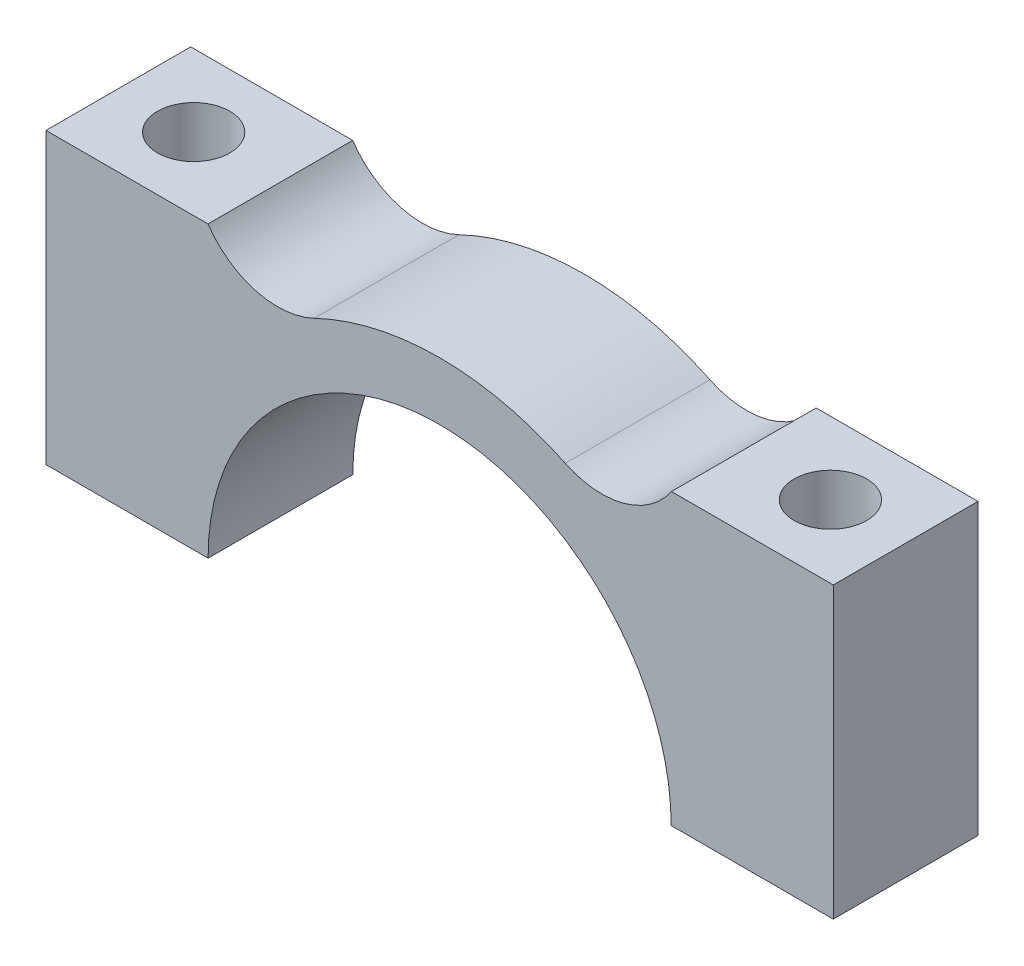
ISO-10303-21;
HEADER;
FILE_DESCRIPTION(('STEP AP214'),'2;1');
FILE_NAME('part.step','',(''),(''),'','','');
FILE_SCHEMA(('AUTOMOTIVE_DESIGN { 1 0 10303 214 1 1 1 1 }'));
ENDSEC;
DATA;
#1=APPLICATION_CONTEXT('core data for automotive mechanical design processes');
#2=APPLICATION_PROTOCOL_DEFINITION('international standard','automotive_design',2000,#1);
#3=PRODUCT_CONTEXT('',#1,'mechanical');
#4=PRODUCT('Part','Part','',(#3));
#5=PRODUCT_RELATED_PRODUCT_CATEGORY('part','',(#4));
#6=PRODUCT_DEFINITION_FORMATION('','',#4);
#7=PRODUCT_DEFINITION_CONTEXT('part definition',#1,'design');
#8=PRODUCT_DEFINITION('design','',#6,#7);
#9=PRODUCT_DEFINITION_SHAPE('','',#8);
#10=(LENGTH_UNIT() NAMED_UNIT(*) SI_UNIT(.MILLI.,.METRE.));
#11=(NAMED_UNIT(*) PLANE_ANGLE_UNIT() SI_UNIT($,.RADIAN.));
#12=(NAMED_UNIT(*) SI_UNIT($,.STERADIAN.) SOLID_ANGLE_UNIT());
#13=UNCERTAINTY_MEASURE_WITH_UNIT(LENGTH_MEASURE(1.E-05),#10,'distance_accuracy_value','');
#14=(GEOMETRIC_REPRESENTATION_CONTEXT(3) GLOBAL_UNCERTAINTY_ASSIGNED_CONTEXT((#13)) GLOBAL_UNIT_ASSIGNED_CONTEXT((#10,
#11,#12)) REPRESENTATION_CONTEXT('',''));
#15=CARTESIAN_POINT('',(0.,0.,0.));
#16=DIRECTION('',(0.,0.,1.));
#17=DIRECTION('',(1.,0.,0.));
#18=AXIS2_PLACEMENT_3D('',#15,#16,#17);
#19=CARTESIAN_POINT('',(0.,0.,5.));
#20=DIRECTION('',(0.,-1.,0.));
#21=DIRECTION('',(1.,0.,0.));
#22=AXIS2_PLACEMENT_3D('',#19,#20,#21);
#23=PLANE('',#22);
#24=CARTESIAN_POINT('',(-10.9989308914531,0.,2.49999999999886));
#25=DIRECTION('',(0.,1.,0.));
#26=DIRECTION('',(0.,0.,1.));
#27=AXIS2_PLACEMENT_3D('',#24,#25,#26);
#28=CIRCLE('',#27,1.25);
#29=CARTESIAN_POINT('',(-10.9989308914531,0.,3.74999999999886));
#30=VERTEX_POINT('',#29);
#31=EDGE_CURVE('E142',#30,#30,#28,.T.);
#32=ORIENTED_EDGE('',*,*,#31,.T.);
#33=EDGE_LOOP('',(#32));
#34=FACE_BOUND('',#33,.T.);
#35=DIRECTION('',(-1.,0.,0.));
#36=VECTOR('',#35,1.);
#37=CARTESIAN_POINT('',(0.,0.,0.));
#38=LINE('',#37,#36);
#39=CARTESIAN_POINT('',(-8.,0.,0.));
#40=VERTEX_POINT('',#39);
#41=CARTESIAN_POINT('',(-13.6,0.,0.));
#42=VERTEX_POINT('',#41);
#43=EDGE_CURVE('E139',#40,#42,#38,.T.);
#44=ORIENTED_EDGE('',*,*,#43,.F.);
#45=DIRECTION('',(0.,0.,-1.));
#46=VECTOR('',#45,1.);
#47=CARTESIAN_POINT('',(-8.,0.,5.));
#48=LINE('',#47,#46);
#49=CARTESIAN_POINT('',(-8.,0.,5.));
#50=VERTEX_POINT('',#49);
#51=EDGE_CURVE('E11',#50,#40,#48,.T.);
#52=ORIENTED_EDGE('',*,*,#51,.F.);
#53=DIRECTION('',(-1.,0.,0.));
#54=VECTOR('',#53,1.);
#55=CARTESIAN_POINT('',(0.,0.,5.));
#56=LINE('',#55,#54);
#57=CARTESIAN_POINT('',(-13.6,0.,5.));
#58=VERTEX_POINT('',#57);
#59=EDGE_CURVE('E164',#50,#58,#56,.T.);
#60=ORIENTED_EDGE('',*,*,#59,.T.);
#61=DIRECTION('',(0.,0.,-1.));
#62=VECTOR('',#61,1.);
#63=CARTESIAN_POINT('',(-13.6,0.,5.));
#64=LINE('',#63,#62);
#65=EDGE_CURVE('E50',#58,#42,#64,.T.);
#66=ORIENTED_EDGE('',*,*,#65,.T.);
#67=EDGE_LOOP('',(#44,#52,#60,#66));
#68=FACE_BOUND('',#67,.T.);
#69=ADVANCED_FACE('F34',(#34,#68),#23,.T.);
#70=CARTESIAN_POINT('',(0.,0.,5.));
#71=DIRECTION('',(0.,0.,-1.));
#72=DIRECTION('',(-1.,0.,0.));
#73=AXIS2_PLACEMENT_3D('',#70,#71,#72);
#74=CYLINDRICAL_SURFACE('',#73,8.);
#75=CARTESIAN_POINT('',(0.,0.,0.));
#76=DIRECTION('',(0.,0.,1.));
#77=DIRECTION('',(1.,0.,0.));
#78=AXIS2_PLACEMENT_3D('',#75,#76,#77);
#79=CIRCLE('',#78,8.);
#80=CARTESIAN_POINT('',(8.,0.,0.));
#81=VERTEX_POINT('',#80);
#82=EDGE_CURVE('E141',#81,#40,#79,.T.);
#83=ORIENTED_EDGE('',*,*,#82,.F.);
#84=DIRECTION('',(0.,0.,-1.));
#85=VECTOR('',#84,1.);
#86=CARTESIAN_POINT('',(8.,0.,5.));
#87=LINE('',#86,#85);
#88=CARTESIAN_POINT('',(8.,0.,5.));
#89=VERTEX_POINT('',#88);
#90=EDGE_CURVE('E42',#89,#81,#87,.T.);
#91=ORIENTED_EDGE('',*,*,#90,.F.);
#92=CARTESIAN_POINT('',(0.,0.,5.));
#93=DIRECTION('',(0.,0.,1.));
#94=DIRECTION('',(1.,0.,0.));
#95=AXIS2_PLACEMENT_3D('',#92,#93,#94);
#96=CIRCLE('',#95,8.);
#97=EDGE_CURVE('E192',#89,#50,#96,.T.);
#98=ORIENTED_EDGE('',*,*,#97,.T.);
#99=ORIENTED_EDGE('',*,*,#51,.T.);
#100=EDGE_LOOP('',(#83,#91,#98,#99));
#101=FACE_BOUND('',#100,.T.);
#102=ADVANCED_FACE('F191',(#101),#74,.F.);
#103=CARTESIAN_POINT('',(0.,0.,5.));
#104=DIRECTION('',(0.,1.,0.));
#105=DIRECTION('',(0.,0.,1.));
#106=AXIS2_PLACEMENT_3D('',#103,#104,#105);
#107=PLANE('',#106);
#108=CARTESIAN_POINT('',(11.0010691085469,0.,2.49999999999884));
#109=DIRECTION('',(0.,1.,0.));
#110=DIRECTION('',(0.,0.,1.));
#111=AXIS2_PLACEMENT_3D('',#108,#109,#110);
#112=CIRCLE('',#111,1.25);
#113=CARTESIAN_POINT('',(11.0010691085469,0.,3.74999999999884));
#114=VERTEX_POINT('',#113);
#115=EDGE_CURVE('E215',#114,#114,#112,.T.);
#116=ORIENTED_EDGE('',*,*,#115,.T.);
#117=EDGE_LOOP('',(#116));
#118=FACE_BOUND('',#117,.T.);
#119=DIRECTION('',(1.,0.,0.));
#120=VECTOR('',#119,1.);
#121=CARTESIAN_POINT('',(0.,0.,0.));
#122=LINE('',#121,#120);
#123=CARTESIAN_POINT('',(13.6,0.,0.));
#124=VERTEX_POINT('',#123);
#125=EDGE_CURVE('E145',#81,#124,#122,.T.);
#126=ORIENTED_EDGE('',*,*,#125,.T.);
#127=DIRECTION('',(0.,0.,-1.));
#128=VECTOR('',#127,1.);
#129=CARTESIAN_POINT('',(13.6,0.,5.));
#130=LINE('',#129,#128);
#131=CARTESIAN_POINT('',(13.6,0.,5.));
#132=VERTEX_POINT('',#131);
#133=EDGE_CURVE('E175',#132,#124,#130,.T.);
#134=ORIENTED_EDGE('',*,*,#133,.F.);
#135=DIRECTION('',(1.,0.,0.));
#136=VECTOR('',#135,1.);
#137=CARTESIAN_POINT('',(0.,0.,5.));
#138=LINE('',#137,#136);
#139=EDGE_CURVE('E182',#89,#132,#138,.T.);
#140=ORIENTED_EDGE('',*,*,#139,.F.);
#141=ORIENTED_EDGE('',*,*,#90,.T.);
#142=EDGE_LOOP('',(#126,#134,#140,#141));
#143=FACE_BOUND('',#142,.T.);
#144=ADVANCED_FACE('F180',(#118,#143),#107,.F.);
#145=CARTESIAN_POINT('',(13.6,0.,5.));
#146=DIRECTION('',(-1.,0.,0.));
#147=DIRECTION('',(0.,0.,1.));
#148=AXIS2_PLACEMENT_3D('',#145,#146,#147);
#149=PLANE('',#148);
#150=DIRECTION('',(0.,1.,0.));
#151=VECTOR('',#150,1.);
#152=CARTESIAN_POINT('',(13.6,0.,0.));
#153=LINE('',#152,#151);
#154=CARTESIAN_POINT('',(13.6,10.,0.));
#155=VERTEX_POINT('',#154);
#156=EDGE_CURVE('E147',#124,#155,#153,.T.);
#157=ORIENTED_EDGE('',*,*,#156,.T.);
#158=DIRECTION('',(0.,0.,-1.));
#159=VECTOR('',#158,1.);
#160=CARTESIAN_POINT('',(13.6,10.,5.));
#161=LINE('',#160,#159);
#162=CARTESIAN_POINT('',(13.6,10.,5.));
#163=VERTEX_POINT('',#162);
#164=EDGE_CURVE('E172',#163,#155,#161,.T.);
#165=ORIENTED_EDGE('',*,*,#164,.F.);
#166=DIRECTION('',(0.,1.,0.));
#167=VECTOR('',#166,1.);
#168=CARTESIAN_POINT('',(13.6,0.,5.));
#169=LINE('',#168,#167);
#170=EDGE_CURVE('E224',#132,#163,#169,.T.);
#171=ORIENTED_EDGE('',*,*,#170,.F.);
#172=ORIENTED_EDGE('',*,*,#133,.T.);
#173=EDGE_LOOP('',(#157,#165,#171,#172));
#174=FACE_BOUND('',#173,.T.);
#175=ADVANCED_FACE('F253',(#174),#149,.F.);
#176=CARTESIAN_POINT('',(0.,10.,5.));
#177=DIRECTION('',(0.,-1.,0.));
#178=DIRECTION('',(0.,0.,-1.));
#179=AXIS2_PLACEMENT_3D('',#176,#177,#178);
#180=PLANE('',#179);
#181=CARTESIAN_POINT('',(11.0010691085469,10.,2.49999999999884));
#182=DIRECTION('',(0.,1.,0.));
#183=DIRECTION('',(0.,0.,1.));
#184=AXIS2_PLACEMENT_3D('',#181,#182,#183);
#185=CIRCLE('',#184,1.25);
#186=CARTESIAN_POINT('',(11.0010691085469,10.,3.74999999999884));
#187=VERTEX_POINT('',#186);
#188=EDGE_CURVE('E218',#187,#187,#185,.T.);
#189=ORIENTED_EDGE('',*,*,#188,.F.);
#190=EDGE_LOOP('',(#189));
#191=FACE_BOUND('',#190,.T.);
#192=DIRECTION('',(-1.,0.,0.));
#193=VECTOR('',#192,1.);
#194=CARTESIAN_POINT('',(0.,10.,0.));
#195=LINE('',#194,#193);
#196=CARTESIAN_POINT('',(8.00887124572743,10.,0.));
#197=VERTEX_POINT('',#196);
#198=EDGE_CURVE('E149',#155,#197,#195,.T.);
#199=ORIENTED_EDGE('',*,*,#198,.T.);
#200=DIRECTION('',(0.,0.,-1.));
#201=VECTOR('',#200,1.);
#202=CARTESIAN_POINT('',(8.00887124572743,10.,5.));
#203=LINE('',#202,#201);
#204=CARTESIAN_POINT('',(8.00887124572743,10.,5.));
#205=VERTEX_POINT('',#204);
#206=EDGE_CURVE('E170',#205,#197,#203,.T.);
#207=ORIENTED_EDGE('',*,*,#206,.F.);
#208=DIRECTION('',(-1.,0.,0.));
#209=VECTOR('',#208,1.);
#210=CARTESIAN_POINT('',(0.,10.,5.));
#211=LINE('',#210,#209);
#212=EDGE_CURVE('E226',#163,#205,#211,.T.);
#213=ORIENTED_EDGE('',*,*,#212,.F.);
#214=ORIENTED_EDGE('',*,*,#164,.T.);
#215=EDGE_LOOP('',(#199,#207,#213,#214));
#216=FACE_BOUND('',#215,.T.);
#217=ADVANCED_FACE('F238',(#191,#216),#180,.F.);
#218=CARTESIAN_POINT('',(5.59999999999348,11.6315143932289,5.));
#219=DIRECTION('',(0.,0.,-1.));
#220=DIRECTION('',(-1.,0.,0.));
#221=AXIS2_PLACEMENT_3D('',#218,#219,#220);
#222=CYLINDRICAL_SURFACE('',#221,2.9093813592991);
#223=CARTESIAN_POINT('',(5.59999999999348,11.6315143932289,0.));
#224=DIRECTION('',(0.,0.,1.));
#225=DIRECTION('',(1.,0.,0.));
#226=AXIS2_PLACEMENT_3D('',#223,#224,#225);
#227=CIRCLE('',#226,2.9093813592991);
#228=CARTESIAN_POINT('',(4.33793056702875,9.01012532630027,0.));
#229=VERTEX_POINT('',#228);
#230=EDGE_CURVE('E152',#229,#197,#227,.T.);
#231=ORIENTED_EDGE('',*,*,#230,.F.);
#232=DIRECTION('',(0.,0.,-1.));
#233=VECTOR('',#232,1.);
#234=CARTESIAN_POINT('',(4.33793056702875,9.01012532630027,5.));
#235=LINE('',#234,#233);
#236=CARTESIAN_POINT('',(4.33793056702875,9.01012532630027,5.));
#237=VERTEX_POINT('',#236);
#238=EDGE_CURVE('E168',#237,#229,#235,.T.);
#239=ORIENTED_EDGE('',*,*,#238,.F.);
#240=CARTESIAN_POINT('',(5.59999999999348,11.6315143932289,5.));
#241=DIRECTION('',(0.,0.,1.));
#242=DIRECTION('',(1.,0.,0.));
#243=AXIS2_PLACEMENT_3D('',#240,#241,#242);
#244=CIRCLE('',#243,2.9093813592991);
#245=EDGE_CURVE('E228',#237,#205,#244,.T.);
#246=ORIENTED_EDGE('',*,*,#245,.T.);
#247=ORIENTED_EDGE('',*,*,#206,.T.);
#248=EDGE_LOOP('',(#231,#239,#246,#247));
#249=FACE_BOUND('',#248,.T.);
#250=ADVANCED_FACE('F232',(#249),#222,.F.);
#251=CARTESIAN_POINT('',(0.,0.,5.));
#252=DIRECTION('',(0.,0.,-1.));
#253=DIRECTION('',(-1.,0.,0.));
#254=AXIS2_PLACEMENT_3D('',#251,#252,#253);
#255=CYLINDRICAL_SURFACE('',#254,10.);
#256=CARTESIAN_POINT('',(0.,0.,0.));
#257=DIRECTION('',(0.,0.,1.));
#258=DIRECTION('',(1.,0.,0.));
#259=AXIS2_PLACEMENT_3D('',#256,#257,#258);
#260=CIRCLE('',#259,10.);
#261=CARTESIAN_POINT('',(-4.33579234993489,9.01115445979293,0.));
#262=VERTEX_POINT('',#261);
#263=EDGE_CURVE('E155',#229,#262,#260,.T.);
#264=ORIENTED_EDGE('',*,*,#263,.T.);
#265=DIRECTION('',(0.,0.,-1.));
#266=VECTOR('',#265,1.);
#267=CARTESIAN_POINT('',(-4.33579234993489,9.01115445979293,5.));
#268=LINE('',#267,#266);
#269=CARTESIAN_POINT('',(-4.33579234993489,9.01115445979293,5.));
#270=VERTEX_POINT('',#269);
#271=EDGE_CURVE('E121',#270,#262,#268,.T.);
#272=ORIENTED_EDGE('',*,*,#271,.F.);
#273=CARTESIAN_POINT('',(0.,0.,5.));
#274=DIRECTION('',(0.,0.,1.));
#275=DIRECTION('',(1.,0.,0.));
#276=AXIS2_PLACEMENT_3D('',#273,#274,#275);
#277=CIRCLE('',#276,10.);
#278=EDGE_CURVE('E130',#237,#270,#277,.T.);
#279=ORIENTED_EDGE('',*,*,#278,.F.);
#280=ORIENTED_EDGE('',*,*,#238,.T.);
#281=EDGE_LOOP('',(#264,#272,#279,#280));
#282=FACE_BOUND('',#281,.T.);
#283=ADVANCED_FACE('F241',(#282),#255,.T.);
#284=CARTESIAN_POINT('',(-5.59660045217725,11.6315143932281,5.));
#285=DIRECTION('',(0.,0.,-1.));
#286=DIRECTION('',(-1.,0.,0.));
#287=AXIS2_PLACEMENT_3D('',#284,#285,#286);
#288=CYLINDRICAL_SURFACE('',#287,2.90790702248758);
#289=CARTESIAN_POINT('',(-5.59660045217725,11.6315143932281,0.));
#290=DIRECTION('',(0.,0.,1.));
#291=DIRECTION('',(1.,0.,0.));
#292=AXIS2_PLACEMENT_3D('',#289,#290,#291);
#293=CIRCLE('',#292,2.90790702248758);
#294=CARTESIAN_POINT('',(-8.0036908194302,10.,0.));
#295=VERTEX_POINT('',#294);
#296=EDGE_CURVE('E117',#295,#262,#293,.T.);
#297=ORIENTED_EDGE('',*,*,#296,.F.);
#298=DIRECTION('',(0.,0.,-1.));
#299=VECTOR('',#298,1.);
#300=CARTESIAN_POINT('',(-8.0036908194302,10.,5.));
#301=LINE('',#300,#299);
#302=CARTESIAN_POINT('',(-8.0036908194302,10.,5.));
#303=VERTEX_POINT('',#302);
#304=EDGE_CURVE('E112',#303,#295,#301,.T.);
#305=ORIENTED_EDGE('',*,*,#304,.F.);
#306=CARTESIAN_POINT('',(-5.59660045217725,11.6315143932281,5.));
#307=DIRECTION('',(0.,0.,1.));
#308=DIRECTION('',(1.,0.,0.));
#309=AXIS2_PLACEMENT_3D('',#306,#307,#308);
#310=CIRCLE('',#309,2.90790702248758);
#311=EDGE_CURVE('E115',#303,#270,#310,.T.);
#312=ORIENTED_EDGE('',*,*,#311,.T.);
#313=ORIENTED_EDGE('',*,*,#271,.T.);
#314=EDGE_LOOP('',(#297,#305,#312,#313));
#315=FACE_BOUND('',#314,.T.);
#316=ADVANCED_FACE('F114',(#315),#288,.F.);
#317=CARTESIAN_POINT('',(0.,10.,5.));
#318=DIRECTION('',(0.,1.,0.));
#319=DIRECTION('',(0.,0.,1.));
#320=AXIS2_PLACEMENT_3D('',#317,#318,#319);
#321=PLANE('',#320);
#322=CARTESIAN_POINT('',(-10.9989308914531,10.,2.49999999999886));
#323=DIRECTION('',(0.,1.,0.));
#324=DIRECTION('',(0.,0.,1.));
#325=AXIS2_PLACEMENT_3D('',#322,#323,#324);
#326=CIRCLE('',#325,1.25);
#327=CARTESIAN_POINT('',(-10.9989308914531,10.,3.74999999999886));
#328=VERTEX_POINT('',#327);
#329=EDGE_CURVE('E212',#328,#328,#326,.T.);
#330=ORIENTED_EDGE('',*,*,#329,.F.);
#331=EDGE_LOOP('',(#330));
#332=FACE_BOUND('',#331,.T.);
#333=DIRECTION('',(1.,0.,0.));
#334=VECTOR('',#333,1.);
#335=CARTESIAN_POINT('',(0.,10.,0.));
#336=LINE('',#335,#334);
#337=CARTESIAN_POINT('',(-13.6,10.,0.));
#338=VERTEX_POINT('',#337);
#339=EDGE_CURVE('E159',#338,#295,#336,.T.);
#340=ORIENTED_EDGE('',*,*,#339,.F.);
#341=DIRECTION('',(0.,0.,-1.));
#342=VECTOR('',#341,1.);
#343=CARTESIAN_POINT('',(-13.6,10.,5.));
#344=LINE('',#343,#342);
#345=CARTESIAN_POINT('',(-13.6,10.,5.));
#346=VERTEX_POINT('',#345);
#347=EDGE_CURVE('E81',#346,#338,#344,.T.);
#348=ORIENTED_EDGE('',*,*,#347,.F.);
#349=DIRECTION('',(1.,0.,0.));
#350=VECTOR('',#349,1.);
#351=CARTESIAN_POINT('',(0.,10.,5.));
#352=LINE('',#351,#350);
#353=EDGE_CURVE('E127',#346,#303,#352,.T.);
#354=ORIENTED_EDGE('',*,*,#353,.T.);
#355=ORIENTED_EDGE('',*,*,#304,.T.);
#356=EDGE_LOOP('',(#340,#348,#354,#355));
#357=FACE_BOUND('',#356,.T.);
#358=ADVANCED_FACE('F133',(#332,#357),#321,.T.);
#359=CARTESIAN_POINT('',(-13.6,0.,5.));
#360=DIRECTION('',(-1.,0.,0.));
#361=DIRECTION('',(0.,0.,1.));
#362=AXIS2_PLACEMENT_3D('',#359,#360,#361);
#363=PLANE('',#362);
#364=DIRECTION('',(0.,1.,0.));
#365=VECTOR('',#364,1.);
#366=CARTESIAN_POINT('',(-13.6,0.,0.));
#367=LINE('',#366,#365);
#368=EDGE_CURVE('E161',#42,#338,#367,.T.);
#369=ORIENTED_EDGE('',*,*,#368,.F.);
#370=ORIENTED_EDGE('',*,*,#65,.F.);
#371=DIRECTION('',(0.,1.,0.));
#372=VECTOR('',#371,1.);
#373=CARTESIAN_POINT('',(-13.6,0.,5.));
#374=LINE('',#373,#372);
#375=EDGE_CURVE('E134',#58,#346,#374,.T.);
#376=ORIENTED_EDGE('',*,*,#375,.T.);
#377=ORIENTED_EDGE('',*,*,#347,.T.);
#378=EDGE_LOOP('',(#369,#370,#376,#377));
#379=FACE_BOUND('',#378,.T.);
#380=ADVANCED_FACE('F193',(#379),#363,.T.);
#381=CARTESIAN_POINT('',(0.,0.,5.));
#382=DIRECTION('',(0.,0.,1.));
#383=DIRECTION('',(1.,0.,0.));
#384=AXIS2_PLACEMENT_3D('',#381,#382,#383);
#385=PLANE('',#384);
#386=ORIENTED_EDGE('',*,*,#59,.F.);
#387=ORIENTED_EDGE('',*,*,#97,.F.);
#388=ORIENTED_EDGE('',*,*,#139,.T.);
#389=ORIENTED_EDGE('',*,*,#170,.T.);
#390=ORIENTED_EDGE('',*,*,#212,.T.);
#391=ORIENTED_EDGE('',*,*,#245,.F.);
#392=ORIENTED_EDGE('',*,*,#278,.T.);
#393=ORIENTED_EDGE('',*,*,#311,.F.);
#394=ORIENTED_EDGE('',*,*,#353,.F.);
#395=ORIENTED_EDGE('',*,*,#375,.F.);
#396=EDGE_LOOP('',(#386,#387,#388,#389,#390,#391,#392,#393,#394,#395));
#397=FACE_BOUND('',#396,.T.);
#398=ADVANCED_FACE('F125',(#397),#385,.T.);
#399=CARTESIAN_POINT('',(0.,0.,0.));
#400=DIRECTION('',(0.,0.,1.));
#401=DIRECTION('',(1.,0.,0.));
#402=AXIS2_PLACEMENT_3D('',#399,#400,#401);
#403=PLANE('',#402);
#404=ORIENTED_EDGE('',*,*,#43,.T.);
#405=ORIENTED_EDGE('',*,*,#368,.T.);
#406=ORIENTED_EDGE('',*,*,#339,.T.);
#407=ORIENTED_EDGE('',*,*,#296,.T.);
#408=ORIENTED_EDGE('',*,*,#263,.F.);
#409=ORIENTED_EDGE('',*,*,#230,.T.);
#410=ORIENTED_EDGE('',*,*,#198,.F.);
#411=ORIENTED_EDGE('',*,*,#156,.F.);
#412=ORIENTED_EDGE('',*,*,#125,.F.);
#413=ORIENTED_EDGE('',*,*,#82,.T.);
#414=EDGE_LOOP('',(#404,#405,#406,#407,#408,#409,#410,#411,#412,#413));
#415=FACE_BOUND('',#414,.T.);
#416=ADVANCED_FACE('F189',(#415),#403,.F.);
#417=CARTESIAN_POINT('',(-10.9989308914531,0.,2.49999999999886));
#418=DIRECTION('',(0.,1.,0.));
#419=DIRECTION('',(0.,0.,1.));
#420=AXIS2_PLACEMENT_3D('',#417,#418,#419);
#421=CYLINDRICAL_SURFACE('',#420,1.25);
#422=ORIENTED_EDGE('',*,*,#31,.F.);
#423=EDGE_LOOP('',(#422));
#424=FACE_BOUND('',#423,.T.);
#425=ORIENTED_EDGE('',*,*,#329,.T.);
#426=EDGE_LOOP('',(#425));
#427=FACE_BOUND('',#426,.T.);
#428=ADVANCED_FACE('F270',(#424,#427),#421,.F.);
#429=CARTESIAN_POINT('',(11.0010691085469,0.,2.49999999999884));
#430=DIRECTION('',(0.,1.,0.));
#431=DIRECTION('',(0.,0.,1.));
#432=AXIS2_PLACEMENT_3D('',#429,#430,#431);
#433=CYLINDRICAL_SURFACE('',#432,1.25);
#434=ORIENTED_EDGE('',*,*,#115,.F.);
#435=EDGE_LOOP('',(#434));
#436=FACE_BOUND('',#435,.T.);
#437=ORIENTED_EDGE('',*,*,#188,.T.);
#438=EDGE_LOOP('',(#437));
#439=FACE_BOUND('',#438,.T.);
#440=ADVANCED_FACE('F268',(#436,#439),#433,.F.);
#441=CLOSED_SHELL('',(#69,#102,#144,#175,#217,#250,#283,#316,#358,#380,#398,#416,#428,#440));
#442=MANIFOLD_SOLID_BREP('B2',#441);
#443=ADVANCED_BREP_SHAPE_REPRESENTATION('',(#18,#442),#14);
#444=SHAPE_DEFINITION_REPRESENTATION(#9,#443);
ENDSEC;
END-ISO-10303-21;
